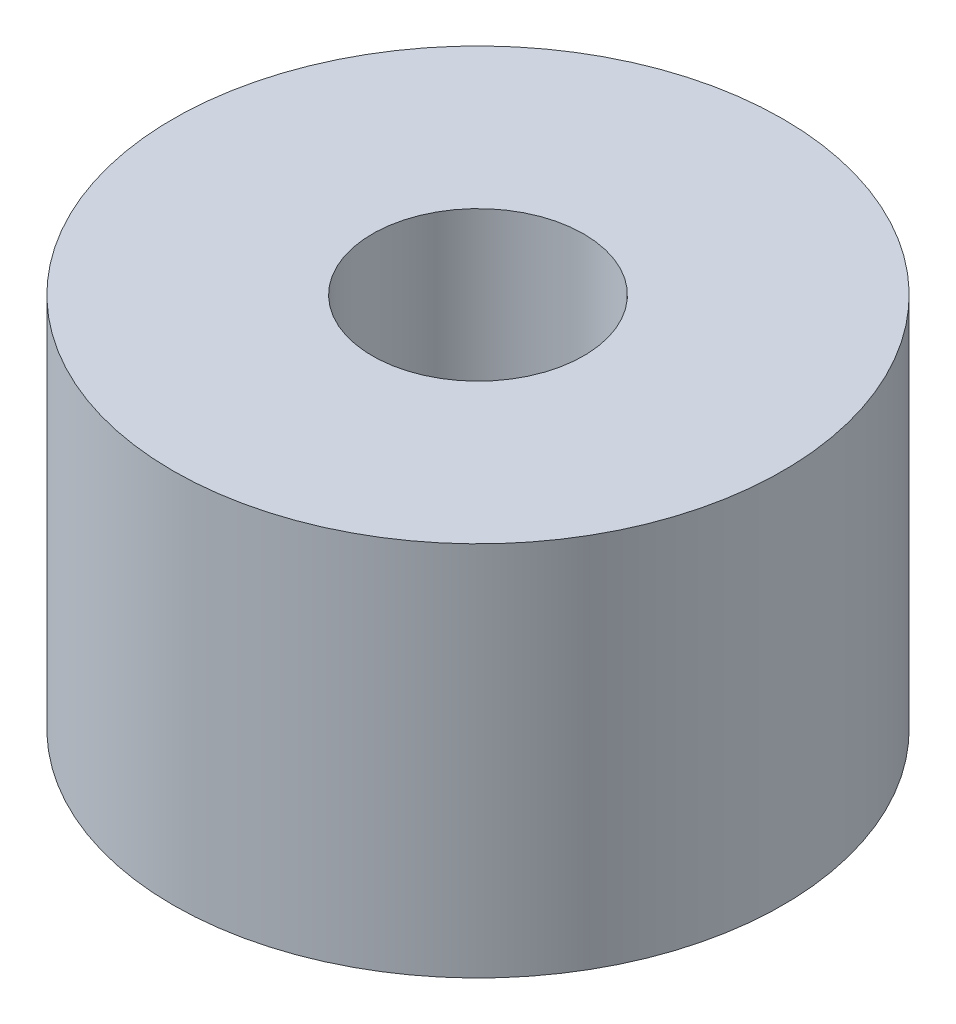
ISO-10303-21;
HEADER;
FILE_DESCRIPTION(('STEP AP214'),'2;1');
FILE_NAME('part.step','',(''),(''),'','','');
FILE_SCHEMA(('AUTOMOTIVE_DESIGN { 1 0 10303 214 1 1 1 1 }'));
ENDSEC;
DATA;
#1=APPLICATION_CONTEXT('core data for automotive mechanical design processes');
#2=APPLICATION_PROTOCOL_DEFINITION('international standard','automotive_design',2000,#1);
#3=PRODUCT_CONTEXT('',#1,'mechanical');
#4=PRODUCT('Part','Part','',(#3));
#5=PRODUCT_RELATED_PRODUCT_CATEGORY('part','',(#4));
#6=PRODUCT_DEFINITION_FORMATION('','',#4);
#7=PRODUCT_DEFINITION_CONTEXT('part definition',#1,'design');
#8=PRODUCT_DEFINITION('design','',#6,#7);
#9=PRODUCT_DEFINITION_SHAPE('','',#8);
#10=(LENGTH_UNIT() NAMED_UNIT(*) SI_UNIT(.MILLI.,.METRE.));
#11=(NAMED_UNIT(*) PLANE_ANGLE_UNIT() SI_UNIT($,.RADIAN.));
#12=(NAMED_UNIT(*) SI_UNIT($,.STERADIAN.) SOLID_ANGLE_UNIT());
#13=UNCERTAINTY_MEASURE_WITH_UNIT(LENGTH_MEASURE(1.E-05),#10,'distance_accuracy_value','');
#14=(GEOMETRIC_REPRESENTATION_CONTEXT(3) GLOBAL_UNCERTAINTY_ASSIGNED_CONTEXT((#13)) GLOBAL_UNIT_ASSIGNED_CONTEXT((#10,
#11,#12)) REPRESENTATION_CONTEXT('',''));
#15=CARTESIAN_POINT('',(0.,0.,0.));
#16=DIRECTION('',(0.,0.,1.));
#17=DIRECTION('',(1.,0.,0.));
#18=AXIS2_PLACEMENT_3D('',#15,#16,#17);
#19=CARTESIAN_POINT('',(0.,0.,0.));
#20=DIRECTION('',(0.,1.,0.));
#21=DIRECTION('',(0.,0.,1.));
#22=AXIS2_PLACEMENT_3D('',#19,#20,#21);
#23=PLANE('',#22);
#24=CARTESIAN_POINT('',(0.,0.,0.));
#25=DIRECTION('',(0.,1.,0.));
#26=DIRECTION('',(0.,0.,1.));
#27=AXIS2_PLACEMENT_3D('',#24,#25,#26);
#28=CIRCLE('',#27,9.525);
#29=CARTESIAN_POINT('',(0.,0.,-9.525));
#30=VERTEX_POINT('',#29);
#31=EDGE_CURVE('E10',#30,#30,#28,.T.);
#32=ORIENTED_EDGE('',*,*,#31,.F.);
#33=EDGE_LOOP('',(#32));
#34=FACE_BOUND('',#33,.T.);
#35=CARTESIAN_POINT('',(0.,0.,0.));
#36=DIRECTION('',(0.,1.,0.));
#37=DIRECTION('',(0.,0.,1.));
#38=AXIS2_PLACEMENT_3D('',#35,#36,#37);
#39=CIRCLE('',#38,3.302);
#40=CARTESIAN_POINT('',(0.,0.,-3.302));
#41=VERTEX_POINT('',#40);
#42=EDGE_CURVE('E51',#41,#41,#39,.T.);
#43=ORIENTED_EDGE('',*,*,#42,.T.);
#44=EDGE_LOOP('',(#43));
#45=FACE_BOUND('',#44,.T.);
#46=ADVANCED_FACE('F43',(#34,#45),#23,.F.);
#47=CARTESIAN_POINT('',(0.,7.62,0.));
#48=DIRECTION('',(0.,-1.,0.));
#49=DIRECTION('',(0.,0.,-1.));
#50=AXIS2_PLACEMENT_3D('',#47,#48,#49);
#51=CYLINDRICAL_SURFACE('',#50,9.525);
#52=CARTESIAN_POINT('',(0.,11.7475,0.));
#53=DIRECTION('',(0.,1.,0.));
#54=DIRECTION('',(0.,0.,1.));
#55=AXIS2_PLACEMENT_3D('',#52,#53,#54);
#56=CIRCLE('',#55,9.525);
#57=CARTESIAN_POINT('',(0.,11.7475,-9.525));
#58=VERTEX_POINT('',#57);
#59=EDGE_CURVE('E56',#58,#58,#56,.T.);
#60=CARTESIAN_POINT('',(0.,0.,-9.525));
#61=CARTESIAN_POINT('',(0.,0.122369791666667,-9.525));
#62=CARTESIAN_POINT('',(0.,0.244739583333333,-9.525));
#63=CARTESIAN_POINT('',(0.,0.489479166666666,-9.525));
#64=CARTESIAN_POINT('',(0.,0.611848958333333,-9.525));
#65=CARTESIAN_POINT('',(0.,0.856588541666667,-9.525));
#66=CARTESIAN_POINT('',(0.,0.978958333333333,-9.525));
#67=CARTESIAN_POINT('',(0.,1.22369791666667,-9.525));
#68=CARTESIAN_POINT('',(0.,1.34606770833333,-9.525));
#69=CARTESIAN_POINT('',(0.,1.59080729166667,-9.525));
#70=CARTESIAN_POINT('',(0.,1.71317708333333,-9.525));
#71=CARTESIAN_POINT('',(0.,1.95791666666667,-9.525));
#72=CARTESIAN_POINT('',(0.,2.08028645833333,-9.525));
#73=CARTESIAN_POINT('',(0.,2.32502604166667,-9.525));
#74=CARTESIAN_POINT('',(0.,2.44739583333333,-9.525));
#75=CARTESIAN_POINT('',(0.,2.69213541666667,-9.525));
#76=CARTESIAN_POINT('',(0.,2.81450520833333,-9.525));
#77=CARTESIAN_POINT('',(0.,3.05924479166667,-9.525));
#78=CARTESIAN_POINT('',(0.,3.18161458333333,-9.525));
#79=CARTESIAN_POINT('',(0.,3.42635416666667,-9.525));
#80=CARTESIAN_POINT('',(0.,3.54872395833333,-9.525));
#81=CARTESIAN_POINT('',(0.,3.79346354166667,-9.525));
#82=CARTESIAN_POINT('',(0.,3.91583333333333,-9.525));
#83=CARTESIAN_POINT('',(0.,4.16057291666667,-9.525));
#84=CARTESIAN_POINT('',(0.,4.28294270833333,-9.525));
#85=CARTESIAN_POINT('',(0.,4.52768229166667,-9.525));
#86=CARTESIAN_POINT('',(0.,4.65005208333333,-9.525));
#87=CARTESIAN_POINT('',(0.,4.89479166666667,-9.525));
#88=CARTESIAN_POINT('',(0.,5.01716145833333,-9.525));
#89=CARTESIAN_POINT('',(0.,5.26190104166667,-9.525));
#90=CARTESIAN_POINT('',(0.,5.38427083333333,-9.525));
#91=CARTESIAN_POINT('',(0.,5.62901041666667,-9.525));
#92=CARTESIAN_POINT('',(0.,5.75138020833333,-9.525));
#93=CARTESIAN_POINT('',(0.,5.99611979166667,-9.525));
#94=CARTESIAN_POINT('',(0.,6.11848958333333,-9.525));
#95=CARTESIAN_POINT('',(0.,6.36322916666667,-9.525));
#96=CARTESIAN_POINT('',(0.,6.48559895833333,-9.525));
#97=CARTESIAN_POINT('',(0.,6.73033854166667,-9.525));
#98=CARTESIAN_POINT('',(0.,6.85270833333333,-9.525));
#99=CARTESIAN_POINT('',(0.,7.09744791666667,-9.525));
#100=CARTESIAN_POINT('',(0.,7.21981770833333,-9.525));
#101=CARTESIAN_POINT('',(0.,7.46455729166667,-9.525));
#102=CARTESIAN_POINT('',(0.,7.58692708333333,-9.525));
#103=CARTESIAN_POINT('',(0.,7.83166666666667,-9.525));
#104=CARTESIAN_POINT('',(0.,7.95403645833333,-9.525));
#105=CARTESIAN_POINT('',(0.,8.19877604166667,-9.525));
#106=CARTESIAN_POINT('',(0.,8.32114583333333,-9.525));
#107=CARTESIAN_POINT('',(0.,8.56588541666667,-9.525));
#108=CARTESIAN_POINT('',(0.,8.68825520833333,-9.525));
#109=CARTESIAN_POINT('',(0.,8.93299479166667,-9.525));
#110=CARTESIAN_POINT('',(0.,9.05536458333333,-9.525));
#111=CARTESIAN_POINT('',(0.,9.30010416666667,-9.525));
#112=CARTESIAN_POINT('',(0.,9.42247395833333,-9.525));
#113=CARTESIAN_POINT('',(0.,9.66721354166667,-9.525));
#114=CARTESIAN_POINT('',(0.,9.78958333333333,-9.525));
#115=CARTESIAN_POINT('',(0.,10.0343229166667,-9.525));
#116=CARTESIAN_POINT('',(0.,10.1566927083333,-9.525));
#117=CARTESIAN_POINT('',(0.,10.4014322916667,-9.525));
#118=CARTESIAN_POINT('',(0.,10.5238020833333,-9.525));
#119=CARTESIAN_POINT('',(0.,10.7685416666667,-9.525));
#120=CARTESIAN_POINT('',(0.,10.8909114583333,-9.525));
#121=CARTESIAN_POINT('',(0.,11.1356510416667,-9.525));
#122=CARTESIAN_POINT('',(0.,11.2580208333333,-9.525));
#123=CARTESIAN_POINT('',(0.,11.5027604166667,-9.525));
#124=CARTESIAN_POINT('',(0.,11.6251302083333,-9.525));
#125=CARTESIAN_POINT('',(0.,11.7475,-9.525));
#126=B_SPLINE_CURVE_WITH_KNOTS('',3,(#60,#61,#62,#63,#64,#65,#66,#67,#68,#69,#70,#71,#72,#73,
#74,#75,#76,#77,#78,#79,#80,#81,#82,#83,#84,#85,#86,#87,#88,#89,#90,#91,#92,#93,#94,#95,#96,#97,
#98,#99,#100,#101,#102,#103,#104,#105,#106,#107,#108,#109,#110,#111,#112,#113,#114,#115,#116,
#117,#118,#119,#120,#121,#122,#123,#124,#125),.UNSPECIFIED.,.F.,.F.,(4,2,2,2,2,2,2,2,2,2,2,2,2,
2,2,2,2,2,2,2,2,2,2,2,2,2,2,2,2,2,2,2,4),(0.,0.367109375,0.73421875,1.101328125,1.4684375,
1.835546875,2.20265625,2.569765625,2.936875,3.303984375,3.67109375,4.038203125,4.4053125,
4.772421875,5.13953125,5.506640625,5.87375,6.240859375,6.60796875,6.975078125,7.3421875,
7.709296875,8.07640625,8.443515625,8.810625,9.177734375,9.54484375,9.911953125,10.2790625,
10.646171875,11.01328125,11.380390625,11.7475),.UNSPECIFIED.);
#127=EDGE_CURVE('BSEAM45',#30,#58,#126,.T.);
#128=ORIENTED_EDGE('',*,*,#31,.T.);
#129=ORIENTED_EDGE('',*,*,#59,.F.);
#130=ORIENTED_EDGE('',*,*,#127,.T.);
#131=ORIENTED_EDGE('',*,*,#127,.F.);
#132=EDGE_LOOP('',(#128,#130,#129,#131));
#133=FACE_BOUND('',#132,.T.);
#134=ADVANCED_FACE('F45',(#133),#51,.T.);
#135=CARTESIAN_POINT('',(0.,7.62,0.));
#136=DIRECTION('',(0.,-1.,0.));
#137=DIRECTION('',(0.,0.,-1.));
#138=AXIS2_PLACEMENT_3D('',#135,#136,#137);
#139=CYLINDRICAL_SURFACE('',#138,3.302);
#140=CARTESIAN_POINT('',(0.,11.7475,0.));
#141=DIRECTION('',(0.,1.,0.));
#142=DIRECTION('',(0.,0.,1.));
#143=AXIS2_PLACEMENT_3D('',#140,#141,#142);
#144=CIRCLE('',#143,3.302);
#145=CARTESIAN_POINT('',(0.,11.7475,-3.302));
#146=VERTEX_POINT('',#145);
#147=EDGE_CURVE('E61',#146,#146,#144,.T.);
#148=CARTESIAN_POINT('',(0.,0.,-3.302));
#149=CARTESIAN_POINT('',(0.,0.122369791666667,-3.302));
#150=CARTESIAN_POINT('',(0.,0.244739583333333,-3.302));
#151=CARTESIAN_POINT('',(0.,0.489479166666666,-3.302));
#152=CARTESIAN_POINT('',(0.,0.611848958333333,-3.302));
#153=CARTESIAN_POINT('',(0.,0.856588541666667,-3.302));
#154=CARTESIAN_POINT('',(0.,0.978958333333333,-3.302));
#155=CARTESIAN_POINT('',(0.,1.22369791666667,-3.302));
#156=CARTESIAN_POINT('',(0.,1.34606770833333,-3.302));
#157=CARTESIAN_POINT('',(0.,1.59080729166667,-3.302));
#158=CARTESIAN_POINT('',(0.,1.71317708333333,-3.302));
#159=CARTESIAN_POINT('',(0.,1.95791666666667,-3.302));
#160=CARTESIAN_POINT('',(0.,2.08028645833333,-3.302));
#161=CARTESIAN_POINT('',(0.,2.32502604166667,-3.302));
#162=CARTESIAN_POINT('',(0.,2.44739583333333,-3.302));
#163=CARTESIAN_POINT('',(0.,2.69213541666667,-3.302));
#164=CARTESIAN_POINT('',(0.,2.81450520833333,-3.302));
#165=CARTESIAN_POINT('',(0.,3.05924479166667,-3.302));
#166=CARTESIAN_POINT('',(0.,3.18161458333333,-3.302));
#167=CARTESIAN_POINT('',(0.,3.42635416666667,-3.302));
#168=CARTESIAN_POINT('',(0.,3.54872395833333,-3.302));
#169=CARTESIAN_POINT('',(0.,3.79346354166667,-3.302));
#170=CARTESIAN_POINT('',(0.,3.91583333333333,-3.302));
#171=CARTESIAN_POINT('',(0.,4.16057291666667,-3.302));
#172=CARTESIAN_POINT('',(0.,4.28294270833333,-3.302));
#173=CARTESIAN_POINT('',(0.,4.52768229166667,-3.302));
#174=CARTESIAN_POINT('',(0.,4.65005208333333,-3.302));
#175=CARTESIAN_POINT('',(0.,4.89479166666667,-3.302));
#176=CARTESIAN_POINT('',(0.,5.01716145833333,-3.302));
#177=CARTESIAN_POINT('',(0.,5.26190104166667,-3.302));
#178=CARTESIAN_POINT('',(0.,5.38427083333333,-3.302));
#179=CARTESIAN_POINT('',(0.,5.62901041666667,-3.302));
#180=CARTESIAN_POINT('',(0.,5.75138020833333,-3.302));
#181=CARTESIAN_POINT('',(0.,5.99611979166667,-3.302));
#182=CARTESIAN_POINT('',(0.,6.11848958333333,-3.302));
#183=CARTESIAN_POINT('',(0.,6.36322916666667,-3.302));
#184=CARTESIAN_POINT('',(0.,6.48559895833333,-3.302));
#185=CARTESIAN_POINT('',(0.,6.73033854166667,-3.302));
#186=CARTESIAN_POINT('',(0.,6.85270833333333,-3.302));
#187=CARTESIAN_POINT('',(0.,7.09744791666667,-3.302));
#188=CARTESIAN_POINT('',(0.,7.21981770833333,-3.302));
#189=CARTESIAN_POINT('',(0.,7.46455729166667,-3.302));
#190=CARTESIAN_POINT('',(0.,7.58692708333333,-3.302));
#191=CARTESIAN_POINT('',(0.,7.83166666666667,-3.302));
#192=CARTESIAN_POINT('',(0.,7.95403645833333,-3.302));
#193=CARTESIAN_POINT('',(0.,8.19877604166667,-3.302));
#194=CARTESIAN_POINT('',(0.,8.32114583333333,-3.302));
#195=CARTESIAN_POINT('',(0.,8.56588541666667,-3.302));
#196=CARTESIAN_POINT('',(0.,8.68825520833333,-3.302));
#197=CARTESIAN_POINT('',(0.,8.93299479166667,-3.302));
#198=CARTESIAN_POINT('',(0.,9.05536458333333,-3.302));
#199=CARTESIAN_POINT('',(0.,9.30010416666667,-3.302));
#200=CARTESIAN_POINT('',(0.,9.42247395833333,-3.302));
#201=CARTESIAN_POINT('',(0.,9.66721354166667,-3.302));
#202=CARTESIAN_POINT('',(0.,9.78958333333333,-3.302));
#203=CARTESIAN_POINT('',(0.,10.0343229166667,-3.302));
#204=CARTESIAN_POINT('',(0.,10.1566927083333,-3.302));
#205=CARTESIAN_POINT('',(0.,10.4014322916667,-3.302));
#206=CARTESIAN_POINT('',(0.,10.5238020833333,-3.302));
#207=CARTESIAN_POINT('',(0.,10.7685416666667,-3.302));
#208=CARTESIAN_POINT('',(0.,10.8909114583333,-3.302));
#209=CARTESIAN_POINT('',(0.,11.1356510416667,-3.302));
#210=CARTESIAN_POINT('',(0.,11.2580208333333,-3.302));
#211=CARTESIAN_POINT('',(0.,11.5027604166667,-3.302));
#212=CARTESIAN_POINT('',(0.,11.6251302083333,-3.302));
#213=CARTESIAN_POINT('',(0.,11.7475,-3.302));
#214=B_SPLINE_CURVE_WITH_KNOTS('',3,(#148,#149,#150,#151,#152,#153,#154,#155,#156,#157,#158,
#159,#160,#161,#162,#163,#164,#165,#166,#167,#168,#169,#170,#171,#172,#173,#174,#175,#176,#177,
#178,#179,#180,#181,#182,#183,#184,#185,#186,#187,#188,#189,#190,#191,#192,#193,#194,#195,#196,
#197,#198,#199,#200,#201,#202,#203,#204,#205,#206,#207,#208,#209,#210,#211,#212,#213),
.UNSPECIFIED.,.F.,.F.,(4,2,2,2,2,2,2,2,2,2,2,2,2,2,2,2,2,2,2,2,2,2,2,2,2,2,2,2,2,2,2,2,4),(0.,
0.367109375,0.73421875,1.101328125,1.4684375,1.835546875,2.20265625,2.569765625,2.936875,
3.303984375,3.67109375,4.038203125,4.4053125,4.772421875,5.13953125,5.506640625,5.87375,
6.240859375,6.60796875,6.975078125,7.3421875,7.709296875,8.07640625,8.443515625,8.810625,
9.177734375,9.54484375,9.911953125,10.2790625,10.646171875,11.01328125,11.380390625,11.7475),.UNSPECIFIED.);
#215=EDGE_CURVE('BSEAM68',#41,#146,#214,.T.);
#216=ORIENTED_EDGE('',*,*,#42,.F.);
#217=ORIENTED_EDGE('',*,*,#147,.T.);
#218=ORIENTED_EDGE('',*,*,#215,.T.);
#219=ORIENTED_EDGE('',*,*,#215,.F.);
#220=EDGE_LOOP('',(#216,#218,#217,#219));
#221=FACE_BOUND('',#220,.T.);
#222=ADVANCED_FACE('F68',(#221),#139,.F.);
#223=CARTESIAN_POINT('',(0.,11.7475,0.));
#224=DIRECTION('',(0.,1.,0.));
#225=DIRECTION('',(0.,0.,1.));
#226=AXIS2_PLACEMENT_3D('',#223,#224,#225);
#227=PLANE('',#226);
#228=ORIENTED_EDGE('',*,*,#59,.T.);
#229=EDGE_LOOP('',(#228));
#230=FACE_BOUND('',#229,.T.);
#231=ORIENTED_EDGE('',*,*,#147,.F.);
#232=EDGE_LOOP('',(#231));
#233=FACE_BOUND('',#232,.T.);
#234=ADVANCED_FACE('F70',(#230,#233),#227,.T.);
#235=CLOSED_SHELL('',(#46,#134,#222,#234));
#236=MANIFOLD_SOLID_BREP('B2',#235);
#237=ADVANCED_BREP_SHAPE_REPRESENTATION('',(#18,#236),#14);
#238=SHAPE_DEFINITION_REPRESENTATION(#9,#237);
ENDSEC;
END-ISO-10303-21;
